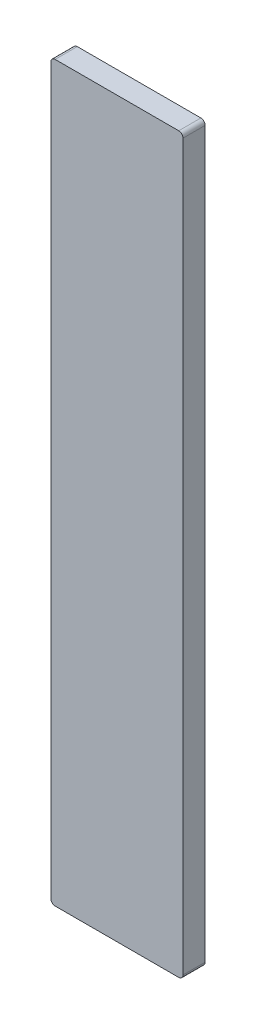
ISO-10303-21;
HEADER;
FILE_DESCRIPTION(('STEP AP214'),'2;1');
FILE_NAME('part.step','',(''),(''),'','','');
FILE_SCHEMA(('AUTOMOTIVE_DESIGN { 1 0 10303 214 1 1 1 1 }'));
ENDSEC;
DATA;
#1=APPLICATION_CONTEXT('core data for automotive mechanical design processes');
#2=APPLICATION_PROTOCOL_DEFINITION('international standard','automotive_design',2000,#1);
#3=PRODUCT_CONTEXT('',#1,'mechanical');
#4=PRODUCT('Part','Part','',(#3));
#5=PRODUCT_RELATED_PRODUCT_CATEGORY('part','',(#4));
#6=PRODUCT_DEFINITION_FORMATION('','',#4);
#7=PRODUCT_DEFINITION_CONTEXT('part definition',#1,'design');
#8=PRODUCT_DEFINITION('design','',#6,#7);
#9=PRODUCT_DEFINITION_SHAPE('','',#8);
#10=(LENGTH_UNIT() NAMED_UNIT(*) SI_UNIT(.MILLI.,.METRE.));
#11=(NAMED_UNIT(*) PLANE_ANGLE_UNIT() SI_UNIT($,.RADIAN.));
#12=(NAMED_UNIT(*) SI_UNIT($,.STERADIAN.) SOLID_ANGLE_UNIT());
#13=UNCERTAINTY_MEASURE_WITH_UNIT(LENGTH_MEASURE(1.E-05),#10,'distance_accuracy_value','');
#14=(GEOMETRIC_REPRESENTATION_CONTEXT(3) GLOBAL_UNCERTAINTY_ASSIGNED_CONTEXT((#13)) GLOBAL_UNIT_ASSIGNED_CONTEXT((#10,
#11,#12)) REPRESENTATION_CONTEXT('',''));
#15=CARTESIAN_POINT('',(0.,0.,0.));
#16=DIRECTION('',(0.,0.,1.));
#17=DIRECTION('',(1.,0.,0.));
#18=AXIS2_PLACEMENT_3D('',#15,#16,#17);
#19=CARTESIAN_POINT('',(5.,5.00000000000002,0.));
#20=DIRECTION('',(0.,0.,-1.));
#21=DIRECTION('',(-1.,0.,0.));
#22=AXIS2_PLACEMENT_3D('',#19,#20,#21);
#23=CYLINDRICAL_SURFACE('',#22,5.);
#24=DIRECTION('',(0.,0.,-1.));
#25=VECTOR('',#24,1.);
#26=CARTESIAN_POINT('',(5.00000000000003,0.,0.));
#27=LINE('',#26,#25);
#28=CARTESIAN_POINT('',(5.,0.,0.));
#29=VERTEX_POINT('',#28);
#30=CARTESIAN_POINT('',(5.,0.,-26.));
#31=VERTEX_POINT('',#30);
#32=EDGE_CURVE('E147',#29,#31,#27,.T.);
#33=ORIENTED_EDGE('',*,*,#32,.F.);
#34=CARTESIAN_POINT('',(5.,5.00000000000002,0.));
#35=DIRECTION('',(0.,0.,-1.));
#36=DIRECTION('',(-1.,0.,0.));
#37=AXIS2_PLACEMENT_3D('',#34,#35,#36);
#38=CIRCLE('',#37,5.);
#39=CARTESIAN_POINT('',(0.,5.,0.));
#40=VERTEX_POINT('',#39);
#41=EDGE_CURVE('E39',#40,#29,#38,.F.);
#42=ORIENTED_EDGE('',*,*,#41,.F.);
#43=DIRECTION('',(0.,0.,-1.));
#44=VECTOR('',#43,1.);
#45=CARTESIAN_POINT('',(0.,5.,0.));
#46=LINE('',#45,#44);
#47=CARTESIAN_POINT('',(0.,5.,-26.));
#48=VERTEX_POINT('',#47);
#49=EDGE_CURVE('E150',#48,#40,#46,.F.);
#50=ORIENTED_EDGE('',*,*,#49,.F.);
#51=CARTESIAN_POINT('',(5.,5.00000000000002,-26.));
#52=DIRECTION('',(0.,0.,-1.));
#53=DIRECTION('',(-1.,0.,0.));
#54=AXIS2_PLACEMENT_3D('',#51,#52,#53);
#55=CIRCLE('',#54,5.);
#56=EDGE_CURVE('E11',#31,#48,#55,.T.);
#57=ORIENTED_EDGE('',*,*,#56,.F.);
#58=EDGE_LOOP('',(#33,#42,#50,#57));
#59=FACE_BOUND('',#58,.T.);
#60=ADVANCED_FACE('F32',(#59),#23,.T.);
#61=CARTESIAN_POINT('',(150.,5.00000000000052,0.));
#62=DIRECTION('',(0.,0.,-1.));
#63=DIRECTION('',(-1.,0.,0.));
#64=AXIS2_PLACEMENT_3D('',#61,#62,#63);
#65=CYLINDRICAL_SURFACE('',#64,5.);
#66=DIRECTION('',(0.,0.,-1.));
#67=VECTOR('',#66,1.);
#68=CARTESIAN_POINT('',(155.,5.00000000000054,0.));
#69=LINE('',#68,#67);
#70=CARTESIAN_POINT('',(155.,5.00000000000054,0.));
#71=VERTEX_POINT('',#70);
#72=CARTESIAN_POINT('',(155.,5.00000000000054,-26.));
#73=VERTEX_POINT('',#72);
#74=EDGE_CURVE('E136',#71,#73,#69,.T.);
#75=ORIENTED_EDGE('',*,*,#74,.F.);
#76=CARTESIAN_POINT('',(150.,5.00000000000052,0.));
#77=DIRECTION('',(0.,0.,-1.));
#78=DIRECTION('',(-1.,0.,0.));
#79=AXIS2_PLACEMENT_3D('',#76,#77,#78);
#80=CIRCLE('',#79,5.);
#81=CARTESIAN_POINT('',(150.,5.23722504166407E-13,0.));
#82=VERTEX_POINT('',#81);
#83=EDGE_CURVE('E142',#82,#71,#80,.F.);
#84=ORIENTED_EDGE('',*,*,#83,.F.);
#85=DIRECTION('',(0.,0.,-1.));
#86=VECTOR('',#85,1.);
#87=CARTESIAN_POINT('',(150.,5.23722504166407E-13,0.));
#88=LINE('',#87,#86);
#89=CARTESIAN_POINT('',(150.,5.23722504166407E-13,-26.));
#90=VERTEX_POINT('',#89);
#91=EDGE_CURVE('E139',#90,#82,#88,.F.);
#92=ORIENTED_EDGE('',*,*,#91,.F.);
#93=CARTESIAN_POINT('',(150.,5.00000000000052,-26.));
#94=DIRECTION('',(0.,0.,-1.));
#95=DIRECTION('',(-1.,0.,0.));
#96=AXIS2_PLACEMENT_3D('',#93,#94,#95);
#97=CIRCLE('',#96,5.);
#98=EDGE_CURVE('E144',#73,#90,#97,.T.);
#99=ORIENTED_EDGE('',*,*,#98,.F.);
#100=EDGE_LOOP('',(#75,#84,#92,#99));
#101=FACE_BOUND('',#100,.T.);
#102=ADVANCED_FACE('F161',(#101),#65,.T.);
#103=CARTESIAN_POINT('',(149.999999999997,855.000000000001,0.));
#104=DIRECTION('',(0.,0.,-1.));
#105=DIRECTION('',(-1.,0.,0.));
#106=AXIS2_PLACEMENT_3D('',#103,#104,#105);
#107=CYLINDRICAL_SURFACE('',#106,5.);
#108=DIRECTION('',(0.,0.,-1.));
#109=VECTOR('',#108,1.);
#110=CARTESIAN_POINT('',(149.999999999997,860.000000000001,0.));
#111=LINE('',#110,#109);
#112=CARTESIAN_POINT('',(149.999999999997,860.000000000001,0.));
#113=VERTEX_POINT('',#112);
#114=CARTESIAN_POINT('',(149.999999999997,860.000000000001,-26.));
#115=VERTEX_POINT('',#114);
#116=EDGE_CURVE('E104',#113,#115,#111,.T.);
#117=ORIENTED_EDGE('',*,*,#116,.F.);
#118=CARTESIAN_POINT('',(149.999999999997,855.000000000001,0.));
#119=DIRECTION('',(0.,0.,-1.));
#120=DIRECTION('',(-1.,0.,0.));
#121=AXIS2_PLACEMENT_3D('',#118,#119,#120);
#122=CIRCLE('',#121,5.);
#123=CARTESIAN_POINT('',(154.999999999997,855.000000000001,0.));
#124=VERTEX_POINT('',#123);
#125=EDGE_CURVE('E131',#124,#113,#122,.F.);
#126=ORIENTED_EDGE('',*,*,#125,.F.);
#127=DIRECTION('',(0.,0.,-1.));
#128=VECTOR('',#127,1.);
#129=CARTESIAN_POINT('',(154.999999999997,855.000000000001,0.));
#130=LINE('',#129,#128);
#131=CARTESIAN_POINT('',(154.999999999997,855.000000000001,-26.));
#132=VERTEX_POINT('',#131);
#133=EDGE_CURVE('E128',#132,#124,#130,.F.);
#134=ORIENTED_EDGE('',*,*,#133,.F.);
#135=CARTESIAN_POINT('',(149.999999999997,855.000000000001,-26.));
#136=DIRECTION('',(0.,0.,-1.));
#137=DIRECTION('',(-1.,0.,0.));
#138=AXIS2_PLACEMENT_3D('',#135,#136,#137);
#139=CIRCLE('',#138,5.);
#140=EDGE_CURVE('E133',#115,#132,#139,.T.);
#141=ORIENTED_EDGE('',*,*,#140,.F.);
#142=EDGE_LOOP('',(#117,#126,#134,#141));
#143=FACE_BOUND('',#142,.T.);
#144=ADVANCED_FACE('F170',(#143),#107,.T.);
#145=CARTESIAN_POINT('',(4.99999999999702,855.,0.));
#146=DIRECTION('',(0.,0.,-1.));
#147=DIRECTION('',(-1.,0.,0.));
#148=AXIS2_PLACEMENT_3D('',#145,#146,#147);
#149=CYLINDRICAL_SURFACE('',#148,5.);
#150=DIRECTION('',(0.,0.,-1.));
#151=VECTOR('',#150,1.);
#152=CARTESIAN_POINT('',(-2.98014474968238E-12,855.,0.));
#153=LINE('',#152,#151);
#154=CARTESIAN_POINT('',(-2.98014474968238E-12,855.,0.));
#155=VERTEX_POINT('',#154);
#156=CARTESIAN_POINT('',(-2.98014474968238E-12,855.,-26.));
#157=VERTEX_POINT('',#156);
#158=EDGE_CURVE('E99',#155,#157,#153,.T.);
#159=ORIENTED_EDGE('',*,*,#158,.F.);
#160=CARTESIAN_POINT('',(4.99999999999702,855.,0.));
#161=DIRECTION('',(0.,0.,-1.));
#162=DIRECTION('',(-1.,0.,0.));
#163=AXIS2_PLACEMENT_3D('',#160,#161,#162);
#164=CIRCLE('',#163,5.);
#165=CARTESIAN_POINT('',(4.99999999999701,860.,0.));
#166=VERTEX_POINT('',#165);
#167=EDGE_CURVE('E105',#166,#155,#164,.F.);
#168=ORIENTED_EDGE('',*,*,#167,.F.);
#169=DIRECTION('',(0.,0.,-1.));
#170=VECTOR('',#169,1.);
#171=CARTESIAN_POINT('',(4.99999999999701,860.,0.));
#172=LINE('',#171,#170);
#173=CARTESIAN_POINT('',(4.99999999999701,860.,-26.));
#174=VERTEX_POINT('',#173);
#175=EDGE_CURVE('E102',#174,#166,#172,.F.);
#176=ORIENTED_EDGE('',*,*,#175,.F.);
#177=CARTESIAN_POINT('',(4.99999999999702,855.,-26.));
#178=DIRECTION('',(0.,0.,-1.));
#179=DIRECTION('',(-1.,0.,0.));
#180=AXIS2_PLACEMENT_3D('',#177,#178,#179);
#181=CIRCLE('',#180,5.);
#182=EDGE_CURVE('E95',#157,#174,#181,.T.);
#183=ORIENTED_EDGE('',*,*,#182,.F.);
#184=EDGE_LOOP('',(#159,#168,#176,#183));
#185=FACE_BOUND('',#184,.T.);
#186=ADVANCED_FACE('F97',(#185),#149,.T.);
#187=CARTESIAN_POINT('',(155.,5.41179920971954E-13,0.));
#188=DIRECTION('',(0.,1.,0.));
#189=DIRECTION('',(-1.,0.,0.));
#190=AXIS2_PLACEMENT_3D('',#187,#188,#189);
#191=PLANE('',#190);
#192=DIRECTION('',(1.,0.,0.));
#193=VECTOR('',#192,1.);
#194=CARTESIAN_POINT('',(155.,5.41179920971954E-13,0.));
#195=LINE('',#194,#193);
#196=EDGE_CURVE('E115',#29,#82,#195,.T.);
#197=ORIENTED_EDGE('',*,*,#196,.F.);
#198=ORIENTED_EDGE('',*,*,#32,.T.);
#199=DIRECTION('',(1.,0.,0.));
#200=VECTOR('',#199,1.);
#201=CARTESIAN_POINT('',(155.,5.41179920971954E-13,-26.));
#202=LINE('',#201,#200);
#203=EDGE_CURVE('E158',#31,#90,#202,.T.);
#204=ORIENTED_EDGE('',*,*,#203,.T.);
#205=ORIENTED_EDGE('',*,*,#91,.T.);
#206=EDGE_LOOP('',(#197,#198,#204,#205));
#207=FACE_BOUND('',#206,.T.);
#208=ADVANCED_FACE('F156',(#207),#191,.F.);
#209=CARTESIAN_POINT('',(155.,5.41179920971954E-13,0.));
#210=DIRECTION('',(-1.,0.,0.));
#211=DIRECTION('',(0.,-1.,0.));
#212=AXIS2_PLACEMENT_3D('',#209,#210,#211);
#213=PLANE('',#212);
#214=DIRECTION('',(0.,1.,0.));
#215=VECTOR('',#214,1.);
#216=CARTESIAN_POINT('',(155.,5.41179920971954E-13,0.));
#217=LINE('',#216,#215);
#218=EDGE_CURVE('E118',#71,#124,#217,.T.);
#219=ORIENTED_EDGE('',*,*,#218,.F.);
#220=ORIENTED_EDGE('',*,*,#74,.T.);
#221=DIRECTION('',(0.,1.,0.));
#222=VECTOR('',#221,1.);
#223=CARTESIAN_POINT('',(155.,5.41179920971954E-13,-26.));
#224=LINE('',#223,#222);
#225=EDGE_CURVE('E120',#73,#132,#224,.T.);
#226=ORIENTED_EDGE('',*,*,#225,.T.);
#227=ORIENTED_EDGE('',*,*,#133,.T.);
#228=EDGE_LOOP('',(#219,#220,#226,#227));
#229=FACE_BOUND('',#228,.T.);
#230=ADVANCED_FACE('F172',(#229),#213,.F.);
#231=CARTESIAN_POINT('',(154.999999999997,860.000000000001,0.));
#232=DIRECTION('',(0.,-1.,0.));
#233=DIRECTION('',(1.,0.,0.));
#234=AXIS2_PLACEMENT_3D('',#231,#232,#233);
#235=PLANE('',#234);
#236=DIRECTION('',(-1.,0.,0.));
#237=VECTOR('',#236,1.);
#238=CARTESIAN_POINT('',(154.999999999997,860.000000000001,0.));
#239=LINE('',#238,#237);
#240=EDGE_CURVE('E166',#113,#166,#239,.T.);
#241=ORIENTED_EDGE('',*,*,#240,.F.);
#242=ORIENTED_EDGE('',*,*,#116,.T.);
#243=DIRECTION('',(-1.,0.,0.));
#244=VECTOR('',#243,1.);
#245=CARTESIAN_POINT('',(154.999999999997,860.000000000001,-26.));
#246=LINE('',#245,#244);
#247=EDGE_CURVE('E116',#115,#174,#246,.T.);
#248=ORIENTED_EDGE('',*,*,#247,.T.);
#249=ORIENTED_EDGE('',*,*,#175,.T.);
#250=EDGE_LOOP('',(#241,#242,#248,#249));
#251=FACE_BOUND('',#250,.T.);
#252=ADVANCED_FACE('F175',(#251),#235,.F.);
#253=CARTESIAN_POINT('',(0.,0.,0.));
#254=DIRECTION('',(1.,0.,0.));
#255=DIRECTION('',(0.,1.,0.));
#256=AXIS2_PLACEMENT_3D('',#253,#254,#255);
#257=PLANE('',#256);
#258=DIRECTION('',(0.,-1.,0.));
#259=VECTOR('',#258,1.);
#260=CARTESIAN_POINT('',(0.,0.,-26.));
#261=LINE('',#260,#259);
#262=EDGE_CURVE('E110',#157,#48,#261,.T.);
#263=ORIENTED_EDGE('',*,*,#262,.T.);
#264=ORIENTED_EDGE('',*,*,#49,.T.);
#265=DIRECTION('',(0.,-1.,0.));
#266=VECTOR('',#265,1.);
#267=CARTESIAN_POINT('',(0.,0.,0.));
#268=LINE('',#267,#266);
#269=EDGE_CURVE('E112',#155,#40,#268,.T.);
#270=ORIENTED_EDGE('',*,*,#269,.F.);
#271=ORIENTED_EDGE('',*,*,#158,.T.);
#272=EDGE_LOOP('',(#263,#264,#270,#271));
#273=FACE_BOUND('',#272,.T.);
#274=ADVANCED_FACE('F109',(#273),#257,.F.);
#275=CARTESIAN_POINT('',(0.,0.,0.));
#276=DIRECTION('',(0.,0.,-1.));
#277=DIRECTION('',(-1.,0.,0.));
#278=AXIS2_PLACEMENT_3D('',#275,#276,#277);
#279=PLANE('',#278);
#280=ORIENTED_EDGE('',*,*,#269,.T.);
#281=ORIENTED_EDGE('',*,*,#41,.T.);
#282=ORIENTED_EDGE('',*,*,#196,.T.);
#283=ORIENTED_EDGE('',*,*,#83,.T.);
#284=ORIENTED_EDGE('',*,*,#218,.T.);
#285=ORIENTED_EDGE('',*,*,#125,.T.);
#286=ORIENTED_EDGE('',*,*,#240,.T.);
#287=ORIENTED_EDGE('',*,*,#167,.T.);
#288=EDGE_LOOP('',(#280,#281,#282,#283,#284,#285,#286,#287));
#289=FACE_BOUND('',#288,.T.);
#290=ADVANCED_FACE('F152',(#289),#279,.F.);
#291=CARTESIAN_POINT('',(0.,0.,-26.));
#292=DIRECTION('',(0.,0.,-1.));
#293=DIRECTION('',(-1.,0.,0.));
#294=AXIS2_PLACEMENT_3D('',#291,#292,#293);
#295=PLANE('',#294);
#296=ORIENTED_EDGE('',*,*,#203,.F.);
#297=ORIENTED_EDGE('',*,*,#56,.T.);
#298=ORIENTED_EDGE('',*,*,#262,.F.);
#299=ORIENTED_EDGE('',*,*,#182,.T.);
#300=ORIENTED_EDGE('',*,*,#247,.F.);
#301=ORIENTED_EDGE('',*,*,#140,.T.);
#302=ORIENTED_EDGE('',*,*,#225,.F.);
#303=ORIENTED_EDGE('',*,*,#98,.T.);
#304=EDGE_LOOP('',(#296,#297,#298,#299,#300,#301,#302,#303));
#305=FACE_BOUND('',#304,.T.);
#306=ADVANCED_FACE('F114',(#305),#295,.T.);
#307=CLOSED_SHELL('',(#60,#102,#144,#186,#208,#230,#252,#274,#290,#306));
#308=MANIFOLD_SOLID_BREP('B2',#307);
#309=ADVANCED_BREP_SHAPE_REPRESENTATION('',(#18,#308),#14);
#310=SHAPE_DEFINITION_REPRESENTATION(#9,#309);
ENDSEC;
END-ISO-10303-21;
